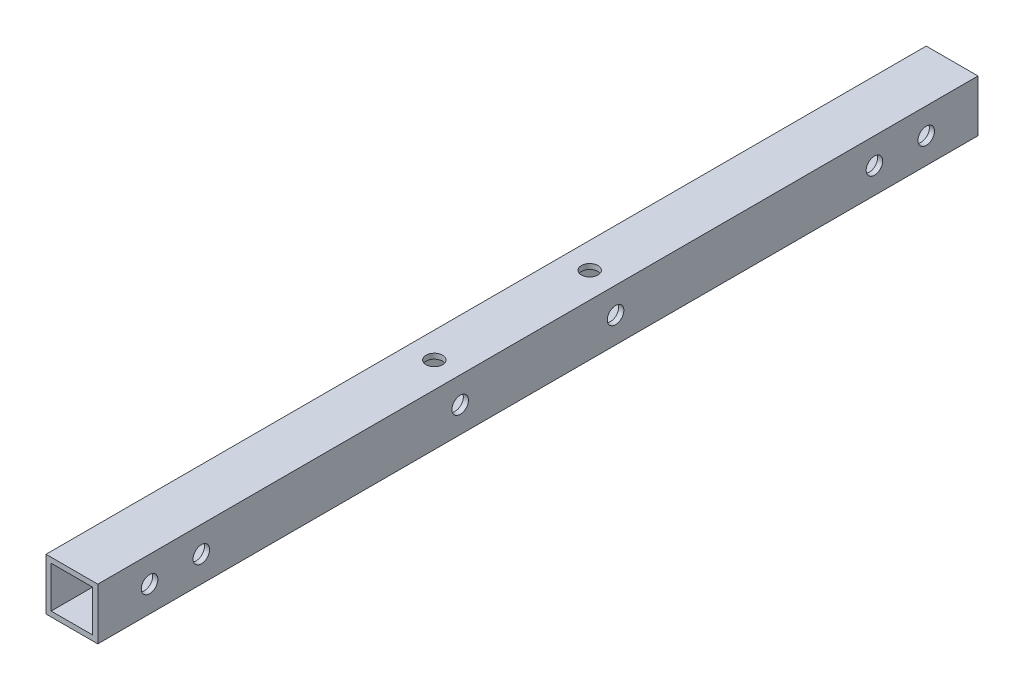
ISO-10303-21;
HEADER;
FILE_DESCRIPTION(('STEP AP214'),'2;1');
FILE_NAME('part.step','',(''),(''),'','','');
FILE_SCHEMA(('AUTOMOTIVE_DESIGN { 1 0 10303 214 1 1 1 1 }'));
ENDSEC;
DATA;
#1=APPLICATION_CONTEXT('core data for automotive mechanical design processes');
#2=APPLICATION_PROTOCOL_DEFINITION('international standard','automotive_design',2000,#1);
#3=PRODUCT_CONTEXT('',#1,'mechanical');
#4=PRODUCT('Part','Part','',(#3));
#5=PRODUCT_RELATED_PRODUCT_CATEGORY('part','',(#4));
#6=PRODUCT_DEFINITION_FORMATION('','',#4);
#7=PRODUCT_DEFINITION_CONTEXT('part definition',#1,'design');
#8=PRODUCT_DEFINITION('design','',#6,#7);
#9=PRODUCT_DEFINITION_SHAPE('','',#8);
#10=(LENGTH_UNIT() NAMED_UNIT(*) SI_UNIT(.MILLI.,.METRE.));
#11=(NAMED_UNIT(*) PLANE_ANGLE_UNIT() SI_UNIT($,.RADIAN.));
#12=(NAMED_UNIT(*) SI_UNIT($,.STERADIAN.) SOLID_ANGLE_UNIT());
#13=UNCERTAINTY_MEASURE_WITH_UNIT(LENGTH_MEASURE(1.E-05),#10,'distance_accuracy_value','');
#14=(GEOMETRIC_REPRESENTATION_CONTEXT(3) GLOBAL_UNCERTAINTY_ASSIGNED_CONTEXT((#13)) GLOBAL_UNIT_ASSIGNED_CONTEXT((#10,
#11,#12)) REPRESENTATION_CONTEXT('',''));
#15=CARTESIAN_POINT('',(0.,0.,0.));
#16=DIRECTION('',(0.,0.,1.));
#17=DIRECTION('',(1.,0.,0.));
#18=AXIS2_PLACEMENT_3D('',#15,#16,#17);
#19=CARTESIAN_POINT('',(0.,0.,170.));
#20=DIRECTION('',(0.,0.,1.));
#21=DIRECTION('',(1.,0.,0.));
#22=AXIS2_PLACEMENT_3D('',#19,#20,#21);
#23=PLANE('',#22);
#24=DIRECTION('',(0.,1.,0.));
#25=VECTOR('',#24,1.);
#26=CARTESIAN_POINT('',(5.,5.,170.));
#27=LINE('',#26,#25);
#28=CARTESIAN_POINT('',(5.,-5.,170.));
#29=VERTEX_POINT('',#28);
#30=CARTESIAN_POINT('',(5.,5.,170.));
#31=VERTEX_POINT('',#30);
#32=EDGE_CURVE('E138',#29,#31,#27,.T.);
#33=ORIENTED_EDGE('',*,*,#32,.T.);
#34=DIRECTION('',(-1.,0.,0.));
#35=VECTOR('',#34,1.);
#36=CARTESIAN_POINT('',(-5.,5.,170.));
#37=LINE('',#36,#35);
#38=CARTESIAN_POINT('',(-5.,5.,170.));
#39=VERTEX_POINT('',#38);
#40=EDGE_CURVE('E141',#31,#39,#37,.T.);
#41=ORIENTED_EDGE('',*,*,#40,.T.);
#42=DIRECTION('',(0.,-1.,0.));
#43=VECTOR('',#42,1.);
#44=CARTESIAN_POINT('',(-5.,5.,170.));
#45=LINE('',#44,#43);
#46=CARTESIAN_POINT('',(-5.,-5.,170.));
#47=VERTEX_POINT('',#46);
#48=EDGE_CURVE('E144',#39,#47,#45,.T.);
#49=ORIENTED_EDGE('',*,*,#48,.T.);
#50=DIRECTION('',(1.,0.,0.));
#51=VECTOR('',#50,1.);
#52=CARTESIAN_POINT('',(-5.,-5.,170.));
#53=LINE('',#52,#51);
#54=EDGE_CURVE('E146',#47,#29,#53,.T.);
#55=ORIENTED_EDGE('',*,*,#54,.T.);
#56=EDGE_LOOP('',(#33,#41,#49,#55));
#57=FACE_BOUND('',#56,.T.);
#58=DIRECTION('',(-1.,0.,0.));
#59=VECTOR('',#58,1.);
#60=CARTESIAN_POINT('',(-4.,4.,170.));
#61=LINE('',#60,#59);
#62=CARTESIAN_POINT('',(4.,4.,170.));
#63=VERTEX_POINT('',#62);
#64=CARTESIAN_POINT('',(-4.,4.,170.));
#65=VERTEX_POINT('',#64);
#66=EDGE_CURVE('E108',#63,#65,#61,.T.);
#67=ORIENTED_EDGE('',*,*,#66,.F.);
#68=DIRECTION('',(0.,1.,0.));
#69=VECTOR('',#68,1.);
#70=CARTESIAN_POINT('',(4.,4.,170.));
#71=LINE('',#70,#69);
#72=CARTESIAN_POINT('',(4.,-4.,170.));
#73=VERTEX_POINT('',#72);
#74=EDGE_CURVE('E100',#73,#63,#71,.T.);
#75=ORIENTED_EDGE('',*,*,#74,.F.);
#76=DIRECTION('',(1.,0.,0.));
#77=VECTOR('',#76,1.);
#78=CARTESIAN_POINT('',(-4.,-4.,170.));
#79=LINE('',#78,#77);
#80=CARTESIAN_POINT('',(-4.,-4.,170.));
#81=VERTEX_POINT('',#80);
#82=EDGE_CURVE('E122',#81,#73,#79,.T.);
#83=ORIENTED_EDGE('',*,*,#82,.F.);
#84=DIRECTION('',(0.,-1.,0.));
#85=VECTOR('',#84,1.);
#86=CARTESIAN_POINT('',(-4.,4.,170.));
#87=LINE('',#86,#85);
#88=EDGE_CURVE('E120',#65,#81,#87,.T.);
#89=ORIENTED_EDGE('',*,*,#88,.F.);
#90=EDGE_LOOP('',(#67,#75,#83,#89));
#91=FACE_BOUND('',#90,.T.);
#92=ADVANCED_FACE('F33',(#57,#91),#23,.T.);
#93=CARTESIAN_POINT('',(0.,0.,0.));
#94=DIRECTION('',(0.,0.,1.));
#95=DIRECTION('',(1.,0.,0.));
#96=AXIS2_PLACEMENT_3D('',#93,#94,#95);
#97=PLANE('',#96);
#98=DIRECTION('',(0.,1.,0.));
#99=VECTOR('',#98,1.);
#100=CARTESIAN_POINT('',(5.,5.,0.));
#101=LINE('',#100,#99);
#102=CARTESIAN_POINT('',(5.,-5.,0.));
#103=VERTEX_POINT('',#102);
#104=CARTESIAN_POINT('',(5.,5.,0.));
#105=VERTEX_POINT('',#104);
#106=EDGE_CURVE('E116',#103,#105,#101,.T.);
#107=ORIENTED_EDGE('',*,*,#106,.F.);
#108=DIRECTION('',(1.,0.,0.));
#109=VECTOR('',#108,1.);
#110=CARTESIAN_POINT('',(-5.,-5.,0.));
#111=LINE('',#110,#109);
#112=CARTESIAN_POINT('',(-5.,-5.,0.));
#113=VERTEX_POINT('',#112);
#114=EDGE_CURVE('E142',#113,#103,#111,.T.);
#115=ORIENTED_EDGE('',*,*,#114,.F.);
#116=DIRECTION('',(0.,-1.,0.));
#117=VECTOR('',#116,1.);
#118=CARTESIAN_POINT('',(-5.,5.,0.));
#119=LINE('',#118,#117);
#120=CARTESIAN_POINT('',(-5.,5.,0.));
#121=VERTEX_POINT('',#120);
#122=EDGE_CURVE('E153',#121,#113,#119,.T.);
#123=ORIENTED_EDGE('',*,*,#122,.F.);
#124=DIRECTION('',(-1.,0.,0.));
#125=VECTOR('',#124,1.);
#126=CARTESIAN_POINT('',(-5.,5.,0.));
#127=LINE('',#126,#125);
#128=EDGE_CURVE('E151',#105,#121,#127,.T.);
#129=ORIENTED_EDGE('',*,*,#128,.F.);
#130=EDGE_LOOP('',(#107,#115,#123,#129));
#131=FACE_BOUND('',#130,.T.);
#132=DIRECTION('',(0.,1.,0.));
#133=VECTOR('',#132,1.);
#134=CARTESIAN_POINT('',(4.,4.,0.));
#135=LINE('',#134,#133);
#136=CARTESIAN_POINT('',(4.,-4.,0.));
#137=VERTEX_POINT('',#136);
#138=CARTESIAN_POINT('',(4.,4.,0.));
#139=VERTEX_POINT('',#138);
#140=EDGE_CURVE('E58',#137,#139,#135,.T.);
#141=ORIENTED_EDGE('',*,*,#140,.T.);
#142=DIRECTION('',(-1.,0.,0.));
#143=VECTOR('',#142,1.);
#144=CARTESIAN_POINT('',(-4.,4.,0.));
#145=LINE('',#144,#143);
#146=CARTESIAN_POINT('',(-4.,4.,0.));
#147=VERTEX_POINT('',#146);
#148=EDGE_CURVE('E115',#139,#147,#145,.T.);
#149=ORIENTED_EDGE('',*,*,#148,.T.);
#150=DIRECTION('',(0.,-1.,0.));
#151=VECTOR('',#150,1.);
#152=CARTESIAN_POINT('',(-4.,4.,0.));
#153=LINE('',#152,#151);
#154=CARTESIAN_POINT('',(-4.,-4.,0.));
#155=VERTEX_POINT('',#154);
#156=EDGE_CURVE('E130',#147,#155,#153,.T.);
#157=ORIENTED_EDGE('',*,*,#156,.T.);
#158=DIRECTION('',(1.,0.,0.));
#159=VECTOR('',#158,1.);
#160=CARTESIAN_POINT('',(-4.,-4.,0.));
#161=LINE('',#160,#159);
#162=EDGE_CURVE('E109',#155,#137,#161,.T.);
#163=ORIENTED_EDGE('',*,*,#162,.T.);
#164=EDGE_LOOP('',(#141,#149,#157,#163));
#165=FACE_BOUND('',#164,.T.);
#166=ADVANCED_FACE('F287',(#131,#165),#97,.F.);
#167=CARTESIAN_POINT('',(5.,5.,170.));
#168=DIRECTION('',(-1.,0.,0.));
#169=DIRECTION('',(0.,-1.,0.));
#170=AXIS2_PLACEMENT_3D('',#167,#168,#169);
#171=PLANE('',#170);
#172=CARTESIAN_POINT('',(5.,0.,70.));
#173=DIRECTION('',(1.,0.,0.));
#174=DIRECTION('',(0.,1.,0.));
#175=AXIS2_PLACEMENT_3D('',#172,#173,#174);
#176=CIRCLE('',#175,1.60000000000001);
#177=CARTESIAN_POINT('',(5.,1.60000000000001,70.));
#178=VERTEX_POINT('',#177);
#179=EDGE_CURVE('E217',#178,#178,#176,.T.);
#180=ORIENTED_EDGE('',*,*,#179,.F.);
#181=EDGE_LOOP('',(#180));
#182=FACE_BOUND('',#181,.T.);
#183=CARTESIAN_POINT('',(5.,0.,150.));
#184=DIRECTION('',(1.,0.,0.));
#185=DIRECTION('',(0.,-1.,0.));
#186=AXIS2_PLACEMENT_3D('',#183,#184,#185);
#187=CIRCLE('',#186,1.60000000000002);
#188=CARTESIAN_POINT('',(5.,-1.60000000000002,150.));
#189=VERTEX_POINT('',#188);
#190=EDGE_CURVE('E218',#189,#189,#187,.T.);
#191=ORIENTED_EDGE('',*,*,#190,.F.);
#192=EDGE_LOOP('',(#191));
#193=FACE_BOUND('',#192,.T.);
#194=CARTESIAN_POINT('',(5.,0.,160.));
#195=DIRECTION('',(1.,0.,0.));
#196=DIRECTION('',(0.,-1.,0.));
#197=AXIS2_PLACEMENT_3D('',#194,#195,#196);
#198=CIRCLE('',#197,1.60000000000002);
#199=CARTESIAN_POINT('',(5.,-1.60000000000002,160.));
#200=VERTEX_POINT('',#199);
#201=EDGE_CURVE('E225',#200,#200,#198,.T.);
#202=ORIENTED_EDGE('',*,*,#201,.F.);
#203=EDGE_LOOP('',(#202));
#204=FACE_BOUND('',#203,.T.);
#205=CARTESIAN_POINT('',(5.,0.,10.));
#206=DIRECTION('',(1.,0.,0.));
#207=DIRECTION('',(0.,1.,0.));
#208=AXIS2_PLACEMENT_3D('',#205,#206,#207);
#209=CIRCLE('',#208,1.6);
#210=CARTESIAN_POINT('',(5.,1.6,10.));
#211=VERTEX_POINT('',#210);
#212=EDGE_CURVE('E230',#211,#211,#209,.T.);
#213=ORIENTED_EDGE('',*,*,#212,.F.);
#214=EDGE_LOOP('',(#213));
#215=FACE_BOUND('',#214,.T.);
#216=CARTESIAN_POINT('',(5.,0.,100.));
#217=DIRECTION('',(1.,0.,0.));
#218=DIRECTION('',(0.,-1.,0.));
#219=AXIS2_PLACEMENT_3D('',#216,#217,#218);
#220=CIRCLE('',#219,1.60000000000001);
#221=CARTESIAN_POINT('',(5.,-1.6,100.));
#222=VERTEX_POINT('',#221);
#223=EDGE_CURVE('E211',#222,#222,#220,.T.);
#224=ORIENTED_EDGE('',*,*,#223,.F.);
#225=EDGE_LOOP('',(#224));
#226=FACE_BOUND('',#225,.T.);
#227=CARTESIAN_POINT('',(5.,0.,20.));
#228=DIRECTION('',(1.,0.,0.));
#229=DIRECTION('',(0.,1.,0.));
#230=AXIS2_PLACEMENT_3D('',#227,#228,#229);
#231=CIRCLE('',#230,1.6);
#232=CARTESIAN_POINT('',(5.,1.6,20.));
#233=VERTEX_POINT('',#232);
#234=EDGE_CURVE('E237',#233,#233,#231,.T.);
#235=ORIENTED_EDGE('',*,*,#234,.F.);
#236=EDGE_LOOP('',(#235));
#237=FACE_BOUND('',#236,.T.);
#238=ORIENTED_EDGE('',*,*,#106,.T.);
#239=DIRECTION('',(0.,0.,-1.));
#240=VECTOR('',#239,1.);
#241=CARTESIAN_POINT('',(5.,5.,170.));
#242=LINE('',#241,#240);
#243=EDGE_CURVE('E11',#31,#105,#242,.T.);
#244=ORIENTED_EDGE('',*,*,#243,.F.);
#245=ORIENTED_EDGE('',*,*,#32,.F.);
#246=DIRECTION('',(0.,0.,-1.));
#247=VECTOR('',#246,1.);
#248=CARTESIAN_POINT('',(5.,-5.,170.));
#249=LINE('',#248,#247);
#250=EDGE_CURVE('E148',#29,#103,#249,.T.);
#251=ORIENTED_EDGE('',*,*,#250,.T.);
#252=EDGE_LOOP('',(#238,#244,#245,#251));
#253=FACE_BOUND('',#252,.T.);
#254=ADVANCED_FACE('F35',(#182,#193,#204,#215,#226,#237,#253),#171,.F.);
#255=CARTESIAN_POINT('',(-5.,5.,170.));
#256=DIRECTION('',(0.,-1.,0.));
#257=DIRECTION('',(0.,0.,-1.));
#258=AXIS2_PLACEMENT_3D('',#255,#256,#257);
#259=PLANE('',#258);
#260=CARTESIAN_POINT('',(0.,5.,70.));
#261=DIRECTION('',(0.,1.,0.));
#262=DIRECTION('',(0.,0.,1.));
#263=AXIS2_PLACEMENT_3D('',#260,#261,#262);
#264=CIRCLE('',#263,1.6);
#265=CARTESIAN_POINT('',(0.,5.,71.6));
#266=VERTEX_POINT('',#265);
#267=EDGE_CURVE('E195',#266,#266,#264,.T.);
#268=ORIENTED_EDGE('',*,*,#267,.F.);
#269=EDGE_LOOP('',(#268));
#270=FACE_BOUND('',#269,.T.);
#271=CARTESIAN_POINT('',(0.,5.,100.));
#272=DIRECTION('',(0.,1.,0.));
#273=DIRECTION('',(0.,0.,-1.));
#274=AXIS2_PLACEMENT_3D('',#271,#272,#273);
#275=CIRCLE('',#274,1.6);
#276=CARTESIAN_POINT('',(0.,5.,98.4));
#277=VERTEX_POINT('',#276);
#278=EDGE_CURVE('E205',#277,#277,#275,.T.);
#279=ORIENTED_EDGE('',*,*,#278,.F.);
#280=EDGE_LOOP('',(#279));
#281=FACE_BOUND('',#280,.T.);
#282=ORIENTED_EDGE('',*,*,#128,.T.);
#283=DIRECTION('',(0.,0.,-1.));
#284=VECTOR('',#283,1.);
#285=CARTESIAN_POINT('',(-5.,5.,170.));
#286=LINE('',#285,#284);
#287=EDGE_CURVE('E42',#39,#121,#286,.T.);
#288=ORIENTED_EDGE('',*,*,#287,.F.);
#289=ORIENTED_EDGE('',*,*,#40,.F.);
#290=ORIENTED_EDGE('',*,*,#243,.T.);
#291=EDGE_LOOP('',(#282,#288,#289,#290));
#292=FACE_BOUND('',#291,.T.);
#293=ADVANCED_FACE('F286',(#270,#281,#292),#259,.F.);
#294=CARTESIAN_POINT('',(-5.,5.,170.));
#295=DIRECTION('',(1.,0.,0.));
#296=DIRECTION('',(0.,1.,0.));
#297=AXIS2_PLACEMENT_3D('',#294,#295,#296);
#298=PLANE('',#297);
#299=CARTESIAN_POINT('',(-5.,0.,70.));
#300=DIRECTION('',(1.,0.,0.));
#301=DIRECTION('',(0.,1.,0.));
#302=AXIS2_PLACEMENT_3D('',#299,#300,#301);
#303=CIRCLE('',#302,1.60000000000001);
#304=CARTESIAN_POINT('',(-5.,1.6,70.));
#305=VERTEX_POINT('',#304);
#306=EDGE_CURVE('E222',#305,#305,#303,.F.);
#307=ORIENTED_EDGE('',*,*,#306,.F.);
#308=EDGE_LOOP('',(#307));
#309=FACE_BOUND('',#308,.T.);
#310=CARTESIAN_POINT('',(-5.,0.,150.));
#311=DIRECTION('',(1.,0.,0.));
#312=DIRECTION('',(0.,1.,0.));
#313=AXIS2_PLACEMENT_3D('',#310,#311,#312);
#314=CIRCLE('',#313,1.60000000000002);
#315=CARTESIAN_POINT('',(-5.,1.60000000000002,150.));
#316=VERTEX_POINT('',#315);
#317=EDGE_CURVE('E221',#316,#316,#314,.F.);
#318=ORIENTED_EDGE('',*,*,#317,.F.);
#319=EDGE_LOOP('',(#318));
#320=FACE_BOUND('',#319,.T.);
#321=CARTESIAN_POINT('',(-5.,0.,160.));
#322=DIRECTION('',(1.,0.,0.));
#323=DIRECTION('',(0.,1.,0.));
#324=AXIS2_PLACEMENT_3D('',#321,#322,#323);
#325=CIRCLE('',#324,1.60000000000002);
#326=CARTESIAN_POINT('',(-5.,1.60000000000002,160.));
#327=VERTEX_POINT('',#326);
#328=EDGE_CURVE('E234',#327,#327,#325,.F.);
#329=ORIENTED_EDGE('',*,*,#328,.F.);
#330=EDGE_LOOP('',(#329));
#331=FACE_BOUND('',#330,.T.);
#332=CARTESIAN_POINT('',(-5.,0.,10.));
#333=DIRECTION('',(1.,0.,0.));
#334=DIRECTION('',(0.,1.,0.));
#335=AXIS2_PLACEMENT_3D('',#332,#333,#334);
#336=CIRCLE('',#335,1.6);
#337=CARTESIAN_POINT('',(-5.,1.6,10.));
#338=VERTEX_POINT('',#337);
#339=EDGE_CURVE('E233',#338,#338,#336,.F.);
#340=ORIENTED_EDGE('',*,*,#339,.F.);
#341=EDGE_LOOP('',(#340));
#342=FACE_BOUND('',#341,.T.);
#343=CARTESIAN_POINT('',(-5.,0.,100.));
#344=DIRECTION('',(1.,0.,0.));
#345=DIRECTION('',(0.,1.,0.));
#346=AXIS2_PLACEMENT_3D('',#343,#344,#345);
#347=CIRCLE('',#346,1.60000000000001);
#348=CARTESIAN_POINT('',(-5.,1.6,100.));
#349=VERTEX_POINT('',#348);
#350=EDGE_CURVE('E214',#349,#349,#347,.F.);
#351=ORIENTED_EDGE('',*,*,#350,.F.);
#352=EDGE_LOOP('',(#351));
#353=FACE_BOUND('',#352,.T.);
#354=CARTESIAN_POINT('',(-5.,0.,20.));
#355=DIRECTION('',(1.,0.,0.));
#356=DIRECTION('',(0.,1.,0.));
#357=AXIS2_PLACEMENT_3D('',#354,#355,#356);
#358=CIRCLE('',#357,1.6);
#359=CARTESIAN_POINT('',(-5.,1.6,20.));
#360=VERTEX_POINT('',#359);
#361=EDGE_CURVE('E167',#360,#360,#358,.F.);
#362=ORIENTED_EDGE('',*,*,#361,.F.);
#363=EDGE_LOOP('',(#362));
#364=FACE_BOUND('',#363,.T.);
#365=ORIENTED_EDGE('',*,*,#122,.T.);
#366=DIRECTION('',(0.,0.,-1.));
#367=VECTOR('',#366,1.);
#368=CARTESIAN_POINT('',(-5.,-5.,170.));
#369=LINE('',#368,#367);
#370=EDGE_CURVE('E158',#47,#113,#369,.T.);
#371=ORIENTED_EDGE('',*,*,#370,.F.);
#372=ORIENTED_EDGE('',*,*,#48,.F.);
#373=ORIENTED_EDGE('',*,*,#287,.T.);
#374=EDGE_LOOP('',(#365,#371,#372,#373));
#375=FACE_BOUND('',#374,.T.);
#376=ADVANCED_FACE('F305',(#309,#320,#331,#342,#353,#364,#375),#298,.F.);
#377=CARTESIAN_POINT('',(-5.,-5.,170.));
#378=DIRECTION('',(0.,1.,0.));
#379=DIRECTION('',(0.,0.,1.));
#380=AXIS2_PLACEMENT_3D('',#377,#378,#379);
#381=PLANE('',#380);
#382=CARTESIAN_POINT('',(0.,-5.,70.));
#383=DIRECTION('',(0.,1.,0.));
#384=DIRECTION('',(0.,0.,1.));
#385=AXIS2_PLACEMENT_3D('',#382,#383,#384);
#386=CIRCLE('',#385,1.6);
#387=CARTESIAN_POINT('',(0.,-5.,71.6));
#388=VERTEX_POINT('',#387);
#389=EDGE_CURVE('E189',#388,#388,#386,.T.);
#390=ORIENTED_EDGE('',*,*,#389,.T.);
#391=EDGE_LOOP('',(#390));
#392=FACE_BOUND('',#391,.T.);
#393=CARTESIAN_POINT('',(0.,-5.,100.));
#394=DIRECTION('',(0.,1.,0.));
#395=DIRECTION('',(0.,0.,-1.));
#396=AXIS2_PLACEMENT_3D('',#393,#394,#395);
#397=CIRCLE('',#396,1.6);
#398=CARTESIAN_POINT('',(0.,-5.,98.4));
#399=VERTEX_POINT('',#398);
#400=EDGE_CURVE('E200',#399,#399,#397,.T.);
#401=ORIENTED_EDGE('',*,*,#400,.T.);
#402=EDGE_LOOP('',(#401));
#403=FACE_BOUND('',#402,.T.);
#404=ORIENTED_EDGE('',*,*,#114,.T.);
#405=ORIENTED_EDGE('',*,*,#250,.F.);
#406=ORIENTED_EDGE('',*,*,#54,.F.);
#407=ORIENTED_EDGE('',*,*,#370,.T.);
#408=EDGE_LOOP('',(#404,#405,#406,#407));
#409=FACE_BOUND('',#408,.T.);
#410=ADVANCED_FACE('F263',(#392,#403,#409),#381,.F.);
#411=CARTESIAN_POINT('',(4.,4.,170.));
#412=DIRECTION('',(-1.,0.,0.));
#413=DIRECTION('',(0.,-1.,0.));
#414=AXIS2_PLACEMENT_3D('',#411,#412,#413);
#415=PLANE('',#414);
#416=CARTESIAN_POINT('',(4.,0.,70.));
#417=DIRECTION('',(-1.,0.,0.));
#418=DIRECTION('',(0.,-1.,0.));
#419=AXIS2_PLACEMENT_3D('',#416,#417,#418);
#420=CIRCLE('',#419,1.60000000000001);
#421=CARTESIAN_POINT('',(4.,-1.6,70.));
#422=VERTEX_POINT('',#421);
#423=EDGE_CURVE('E128',#422,#422,#420,.T.);
#424=ORIENTED_EDGE('',*,*,#423,.F.);
#425=EDGE_LOOP('',(#424));
#426=FACE_BOUND('',#425,.T.);
#427=CARTESIAN_POINT('',(4.,0.,150.));
#428=DIRECTION('',(-1.,0.,0.));
#429=DIRECTION('',(0.,-1.,0.));
#430=AXIS2_PLACEMENT_3D('',#427,#428,#429);
#431=CIRCLE('',#430,1.60000000000002);
#432=CARTESIAN_POINT('',(4.,-1.60000000000002,150.));
#433=VERTEX_POINT('',#432);
#434=EDGE_CURVE('E183',#433,#433,#431,.T.);
#435=ORIENTED_EDGE('',*,*,#434,.F.);
#436=EDGE_LOOP('',(#435));
#437=FACE_BOUND('',#436,.T.);
#438=CARTESIAN_POINT('',(4.,0.,160.));
#439=DIRECTION('',(-1.,0.,0.));
#440=DIRECTION('',(0.,-1.,0.));
#441=AXIS2_PLACEMENT_3D('',#438,#439,#440);
#442=CIRCLE('',#441,1.60000000000002);
#443=CARTESIAN_POINT('',(4.,-1.60000000000002,160.));
#444=VERTEX_POINT('',#443);
#445=EDGE_CURVE('E179',#444,#444,#442,.T.);
#446=ORIENTED_EDGE('',*,*,#445,.F.);
#447=EDGE_LOOP('',(#446));
#448=FACE_BOUND('',#447,.T.);
#449=CARTESIAN_POINT('',(4.,0.,10.));
#450=DIRECTION('',(-1.,0.,0.));
#451=DIRECTION('',(0.,-1.,0.));
#452=AXIS2_PLACEMENT_3D('',#449,#450,#451);
#453=CIRCLE('',#452,1.6);
#454=CARTESIAN_POINT('',(4.,-1.6,10.));
#455=VERTEX_POINT('',#454);
#456=EDGE_CURVE('E175',#455,#455,#453,.T.);
#457=ORIENTED_EDGE('',*,*,#456,.F.);
#458=EDGE_LOOP('',(#457));
#459=FACE_BOUND('',#458,.T.);
#460=CARTESIAN_POINT('',(4.,0.,100.));
#461=DIRECTION('',(-1.,0.,0.));
#462=DIRECTION('',(0.,-1.,0.));
#463=AXIS2_PLACEMENT_3D('',#460,#461,#462);
#464=CIRCLE('',#463,1.60000000000001);
#465=CARTESIAN_POINT('',(4.,-1.6,100.));
#466=VERTEX_POINT('',#465);
#467=EDGE_CURVE('E171',#466,#466,#464,.T.);
#468=ORIENTED_EDGE('',*,*,#467,.F.);
#469=EDGE_LOOP('',(#468));
#470=FACE_BOUND('',#469,.T.);
#471=CARTESIAN_POINT('',(4.,0.,20.));
#472=DIRECTION('',(-1.,0.,0.));
#473=DIRECTION('',(0.,-1.,0.));
#474=AXIS2_PLACEMENT_3D('',#471,#472,#473);
#475=CIRCLE('',#474,1.6);
#476=CARTESIAN_POINT('',(4.,-1.6,20.));
#477=VERTEX_POINT('',#476);
#478=EDGE_CURVE('E166',#477,#477,#475,.T.);
#479=ORIENTED_EDGE('',*,*,#478,.F.);
#480=EDGE_LOOP('',(#479));
#481=FACE_BOUND('',#480,.T.);
#482=ORIENTED_EDGE('',*,*,#140,.F.);
#483=DIRECTION('',(0.,0.,-1.));
#484=VECTOR('',#483,1.);
#485=CARTESIAN_POINT('',(4.,-4.,170.));
#486=LINE('',#485,#484);
#487=EDGE_CURVE('E104',#73,#137,#486,.T.);
#488=ORIENTED_EDGE('',*,*,#487,.F.);
#489=ORIENTED_EDGE('',*,*,#74,.T.);
#490=DIRECTION('',(0.,0.,-1.));
#491=VECTOR('',#490,1.);
#492=CARTESIAN_POINT('',(4.,4.,170.));
#493=LINE('',#492,#491);
#494=EDGE_CURVE('E103',#63,#139,#493,.T.);
#495=ORIENTED_EDGE('',*,*,#494,.T.);
#496=EDGE_LOOP('',(#482,#488,#489,#495));
#497=FACE_BOUND('',#496,.T.);
#498=ADVANCED_FACE('F102',(#426,#437,#448,#459,#470,#481,#497),#415,.T.);
#499=CARTESIAN_POINT('',(-4.,4.,170.));
#500=DIRECTION('',(0.,-1.,0.));
#501=DIRECTION('',(0.,0.,-1.));
#502=AXIS2_PLACEMENT_3D('',#499,#500,#501);
#503=PLANE('',#502);
#504=CARTESIAN_POINT('',(0.,4.,70.));
#505=DIRECTION('',(0.,-1.,0.));
#506=DIRECTION('',(0.,0.,-1.));
#507=AXIS2_PLACEMENT_3D('',#504,#505,#506);
#508=CIRCLE('',#507,1.6);
#509=CARTESIAN_POINT('',(0.,4.,68.4));
#510=VERTEX_POINT('',#509);
#511=EDGE_CURVE('E208',#510,#510,#508,.T.);
#512=ORIENTED_EDGE('',*,*,#511,.F.);
#513=EDGE_LOOP('',(#512));
#514=FACE_BOUND('',#513,.T.);
#515=CARTESIAN_POINT('',(0.,4.,100.));
#516=DIRECTION('',(0.,-1.,0.));
#517=DIRECTION('',(0.,0.,-1.));
#518=AXIS2_PLACEMENT_3D('',#515,#516,#517);
#519=CIRCLE('',#518,1.6);
#520=CARTESIAN_POINT('',(0.,4.,98.4));
#521=VERTEX_POINT('',#520);
#522=EDGE_CURVE('E188',#521,#521,#519,.T.);
#523=ORIENTED_EDGE('',*,*,#522,.F.);
#524=EDGE_LOOP('',(#523));
#525=FACE_BOUND('',#524,.T.);
#526=ORIENTED_EDGE('',*,*,#148,.F.);
#527=ORIENTED_EDGE('',*,*,#494,.F.);
#528=ORIENTED_EDGE('',*,*,#66,.T.);
#529=DIRECTION('',(0.,0.,-1.));
#530=VECTOR('',#529,1.);
#531=CARTESIAN_POINT('',(-4.,4.,170.));
#532=LINE('',#531,#530);
#533=EDGE_CURVE('E117',#65,#147,#532,.T.);
#534=ORIENTED_EDGE('',*,*,#533,.T.);
#535=EDGE_LOOP('',(#526,#527,#528,#534));
#536=FACE_BOUND('',#535,.T.);
#537=ADVANCED_FACE('F112',(#514,#525,#536),#503,.T.);
#538=CARTESIAN_POINT('',(-4.,4.,170.));
#539=DIRECTION('',(1.,0.,0.));
#540=DIRECTION('',(0.,0.,-1.));
#541=AXIS2_PLACEMENT_3D('',#538,#539,#540);
#542=PLANE('',#541);
#543=CARTESIAN_POINT('',(-4.,0.,70.));
#544=DIRECTION('',(1.,0.,0.));
#545=DIRECTION('',(0.,0.,-1.));
#546=AXIS2_PLACEMENT_3D('',#543,#544,#545);
#547=CIRCLE('',#546,1.60000000000001);
#548=CARTESIAN_POINT('',(-4.,0.,68.4));
#549=VERTEX_POINT('',#548);
#550=EDGE_CURVE('E184',#549,#549,#547,.T.);
#551=ORIENTED_EDGE('',*,*,#550,.F.);
#552=EDGE_LOOP('',(#551));
#553=FACE_BOUND('',#552,.T.);
#554=CARTESIAN_POINT('',(-4.,0.,150.));
#555=DIRECTION('',(1.,0.,0.));
#556=DIRECTION('',(0.,0.,-1.));
#557=AXIS2_PLACEMENT_3D('',#554,#555,#556);
#558=CIRCLE('',#557,1.60000000000002);
#559=CARTESIAN_POINT('',(-4.,0.,148.4));
#560=VERTEX_POINT('',#559);
#561=EDGE_CURVE('E180',#560,#560,#558,.T.);
#562=ORIENTED_EDGE('',*,*,#561,.F.);
#563=EDGE_LOOP('',(#562));
#564=FACE_BOUND('',#563,.T.);
#565=CARTESIAN_POINT('',(-4.,0.,160.));
#566=DIRECTION('',(1.,0.,0.));
#567=DIRECTION('',(0.,0.,-1.));
#568=AXIS2_PLACEMENT_3D('',#565,#566,#567);
#569=CIRCLE('',#568,1.60000000000002);
#570=CARTESIAN_POINT('',(-4.,0.,158.4));
#571=VERTEX_POINT('',#570);
#572=EDGE_CURVE('E176',#571,#571,#569,.T.);
#573=ORIENTED_EDGE('',*,*,#572,.F.);
#574=EDGE_LOOP('',(#573));
#575=FACE_BOUND('',#574,.T.);
#576=CARTESIAN_POINT('',(-4.,0.,10.));
#577=DIRECTION('',(1.,0.,0.));
#578=DIRECTION('',(0.,0.,-1.));
#579=AXIS2_PLACEMENT_3D('',#576,#577,#578);
#580=CIRCLE('',#579,1.6);
#581=CARTESIAN_POINT('',(-4.,0.,8.40000000000001));
#582=VERTEX_POINT('',#581);
#583=EDGE_CURVE('E172',#582,#582,#580,.T.);
#584=ORIENTED_EDGE('',*,*,#583,.F.);
#585=EDGE_LOOP('',(#584));
#586=FACE_BOUND('',#585,.T.);
#587=CARTESIAN_POINT('',(-4.,0.,100.));
#588=DIRECTION('',(1.,0.,0.));
#589=DIRECTION('',(0.,0.,-1.));
#590=AXIS2_PLACEMENT_3D('',#587,#588,#589);
#591=CIRCLE('',#590,1.60000000000001);
#592=CARTESIAN_POINT('',(-4.,0.,98.4));
#593=VERTEX_POINT('',#592);
#594=EDGE_CURVE('E168',#593,#593,#591,.T.);
#595=ORIENTED_EDGE('',*,*,#594,.F.);
#596=EDGE_LOOP('',(#595));
#597=FACE_BOUND('',#596,.T.);
#598=CARTESIAN_POINT('',(-4.,0.,20.));
#599=DIRECTION('',(1.,0.,0.));
#600=DIRECTION('',(0.,0.,-1.));
#601=AXIS2_PLACEMENT_3D('',#598,#599,#600);
#602=CIRCLE('',#601,1.6);
#603=CARTESIAN_POINT('',(-4.,0.,18.4));
#604=VERTEX_POINT('',#603);
#605=EDGE_CURVE('E163',#604,#604,#602,.T.);
#606=ORIENTED_EDGE('',*,*,#605,.F.);
#607=EDGE_LOOP('',(#606));
#608=FACE_BOUND('',#607,.T.);
#609=ORIENTED_EDGE('',*,*,#156,.F.);
#610=ORIENTED_EDGE('',*,*,#533,.F.);
#611=ORIENTED_EDGE('',*,*,#88,.T.);
#612=DIRECTION('',(0.,0.,-1.));
#613=VECTOR('',#612,1.);
#614=CARTESIAN_POINT('',(-4.,-4.,170.));
#615=LINE('',#614,#613);
#616=EDGE_CURVE('E50',#81,#155,#615,.T.);
#617=ORIENTED_EDGE('',*,*,#616,.T.);
#618=EDGE_LOOP('',(#609,#610,#611,#617));
#619=FACE_BOUND('',#618,.T.);
#620=ADVANCED_FACE('F326',(#553,#564,#575,#586,#597,#608,#619),#542,.T.);
#621=CARTESIAN_POINT('',(-4.,-4.,170.));
#622=DIRECTION('',(0.,1.,0.));
#623=DIRECTION('',(0.,0.,1.));
#624=AXIS2_PLACEMENT_3D('',#621,#622,#623);
#625=PLANE('',#624);
#626=CARTESIAN_POINT('',(0.,-4.,70.));
#627=DIRECTION('',(0.,1.,0.));
#628=DIRECTION('',(0.,0.,1.));
#629=AXIS2_PLACEMENT_3D('',#626,#627,#628);
#630=CIRCLE('',#629,1.6);
#631=CARTESIAN_POINT('',(0.,-4.,71.6));
#632=VERTEX_POINT('',#631);
#633=EDGE_CURVE('E37',#632,#632,#630,.T.);
#634=ORIENTED_EDGE('',*,*,#633,.F.);
#635=EDGE_LOOP('',(#634));
#636=FACE_BOUND('',#635,.T.);
#637=CARTESIAN_POINT('',(0.,-4.,100.));
#638=DIRECTION('',(0.,1.,0.));
#639=DIRECTION('',(0.,0.,1.));
#640=AXIS2_PLACEMENT_3D('',#637,#638,#639);
#641=CIRCLE('',#640,1.6);
#642=CARTESIAN_POINT('',(0.,-4.,101.6));
#643=VERTEX_POINT('',#642);
#644=EDGE_CURVE('E186',#643,#643,#641,.T.);
#645=ORIENTED_EDGE('',*,*,#644,.F.);
#646=EDGE_LOOP('',(#645));
#647=FACE_BOUND('',#646,.T.);
#648=ORIENTED_EDGE('',*,*,#162,.F.);
#649=ORIENTED_EDGE('',*,*,#616,.F.);
#650=ORIENTED_EDGE('',*,*,#82,.T.);
#651=ORIENTED_EDGE('',*,*,#487,.T.);
#652=EDGE_LOOP('',(#648,#649,#650,#651));
#653=FACE_BOUND('',#652,.T.);
#654=ADVANCED_FACE('F330',(#636,#647,#653),#625,.T.);
#655=CARTESIAN_POINT('',(-9.52548339959396,0.,20.));
#656=DIRECTION('',(1.,0.,0.));
#657=DIRECTION('',(0.,1.,0.));
#658=AXIS2_PLACEMENT_3D('',#655,#656,#657);
#659=CYLINDRICAL_SURFACE('',#658,1.6);
#660=ORIENTED_EDGE('',*,*,#605,.T.);
#661=EDGE_LOOP('',(#660));
#662=FACE_BOUND('',#661,.T.);
#663=ORIENTED_EDGE('',*,*,#361,.T.);
#664=EDGE_LOOP('',(#663));
#665=FACE_BOUND('',#664,.T.);
#666=ADVANCED_FACE('F281',(#662,#665),#659,.F.);
#667=CARTESIAN_POINT('',(-9.52548339959396,0.,100.));
#668=DIRECTION('',(1.,0.,0.));
#669=DIRECTION('',(0.,1.,0.));
#670=AXIS2_PLACEMENT_3D('',#667,#668,#669);
#671=CYLINDRICAL_SURFACE('',#670,1.60000000000001);
#672=ORIENTED_EDGE('',*,*,#594,.T.);
#673=EDGE_LOOP('',(#672));
#674=FACE_BOUND('',#673,.T.);
#675=ORIENTED_EDGE('',*,*,#350,.T.);
#676=EDGE_LOOP('',(#675));
#677=FACE_BOUND('',#676,.T.);
#678=ADVANCED_FACE('F336',(#674,#677),#671,.F.);
#679=CARTESIAN_POINT('',(-9.52548339959396,0.,10.));
#680=DIRECTION('',(1.,0.,0.));
#681=DIRECTION('',(0.,1.,0.));
#682=AXIS2_PLACEMENT_3D('',#679,#680,#681);
#683=CYLINDRICAL_SURFACE('',#682,1.6);
#684=ORIENTED_EDGE('',*,*,#583,.T.);
#685=EDGE_LOOP('',(#684));
#686=FACE_BOUND('',#685,.T.);
#687=ORIENTED_EDGE('',*,*,#339,.T.);
#688=EDGE_LOOP('',(#687));
#689=FACE_BOUND('',#688,.T.);
#690=ADVANCED_FACE('F342',(#686,#689),#683,.F.);
#691=CARTESIAN_POINT('',(-9.52548339959396,0.,160.));
#692=DIRECTION('',(1.,0.,0.));
#693=DIRECTION('',(0.,1.,0.));
#694=AXIS2_PLACEMENT_3D('',#691,#692,#693);
#695=CYLINDRICAL_SURFACE('',#694,1.60000000000002);
#696=ORIENTED_EDGE('',*,*,#572,.T.);
#697=EDGE_LOOP('',(#696));
#698=FACE_BOUND('',#697,.T.);
#699=ORIENTED_EDGE('',*,*,#328,.T.);
#700=EDGE_LOOP('',(#699));
#701=FACE_BOUND('',#700,.T.);
#702=ADVANCED_FACE('F338',(#698,#701),#695,.F.);
#703=CARTESIAN_POINT('',(-9.52548339959396,0.,150.));
#704=DIRECTION('',(1.,0.,0.));
#705=DIRECTION('',(0.,1.,0.));
#706=AXIS2_PLACEMENT_3D('',#703,#704,#705);
#707=CYLINDRICAL_SURFACE('',#706,1.60000000000002);
#708=ORIENTED_EDGE('',*,*,#561,.T.);
#709=EDGE_LOOP('',(#708));
#710=FACE_BOUND('',#709,.T.);
#711=ORIENTED_EDGE('',*,*,#317,.T.);
#712=EDGE_LOOP('',(#711));
#713=FACE_BOUND('',#712,.T.);
#714=ADVANCED_FACE('F341',(#710,#713),#707,.F.);
#715=CARTESIAN_POINT('',(-9.52548339959396,0.,70.));
#716=DIRECTION('',(1.,0.,0.));
#717=DIRECTION('',(0.,1.,0.));
#718=AXIS2_PLACEMENT_3D('',#715,#716,#717);
#719=CYLINDRICAL_SURFACE('',#718,1.60000000000001);
#720=ORIENTED_EDGE('',*,*,#550,.T.);
#721=EDGE_LOOP('',(#720));
#722=FACE_BOUND('',#721,.T.);
#723=ORIENTED_EDGE('',*,*,#306,.T.);
#724=EDGE_LOOP('',(#723));
#725=FACE_BOUND('',#724,.T.);
#726=ADVANCED_FACE('F279',(#722,#725),#719,.F.);
#727=ORIENTED_EDGE('',*,*,#478,.T.);
#728=EDGE_LOOP('',(#727));
#729=FACE_BOUND('',#728,.T.);
#730=ORIENTED_EDGE('',*,*,#234,.T.);
#731=EDGE_LOOP('',(#730));
#732=FACE_BOUND('',#731,.T.);
#733=ADVANCED_FACE('F275',(#729,#732),#659,.F.);
#734=ORIENTED_EDGE('',*,*,#467,.T.);
#735=EDGE_LOOP('',(#734));
#736=FACE_BOUND('',#735,.T.);
#737=ORIENTED_EDGE('',*,*,#223,.T.);
#738=EDGE_LOOP('',(#737));
#739=FACE_BOUND('',#738,.T.);
#740=ADVANCED_FACE('F278',(#736,#739),#671,.F.);
#741=ORIENTED_EDGE('',*,*,#456,.T.);
#742=EDGE_LOOP('',(#741));
#743=FACE_BOUND('',#742,.T.);
#744=ORIENTED_EDGE('',*,*,#212,.T.);
#745=EDGE_LOOP('',(#744));
#746=FACE_BOUND('',#745,.T.);
#747=ADVANCED_FACE('F348',(#743,#746),#683,.F.);
#748=ORIENTED_EDGE('',*,*,#445,.T.);
#749=EDGE_LOOP('',(#748));
#750=FACE_BOUND('',#749,.T.);
#751=ORIENTED_EDGE('',*,*,#201,.T.);
#752=EDGE_LOOP('',(#751));
#753=FACE_BOUND('',#752,.T.);
#754=ADVANCED_FACE('F344',(#750,#753),#695,.F.);
#755=ORIENTED_EDGE('',*,*,#434,.T.);
#756=EDGE_LOOP('',(#755));
#757=FACE_BOUND('',#756,.T.);
#758=ORIENTED_EDGE('',*,*,#190,.T.);
#759=EDGE_LOOP('',(#758));
#760=FACE_BOUND('',#759,.T.);
#761=ADVANCED_FACE('F355',(#757,#760),#707,.F.);
#762=ORIENTED_EDGE('',*,*,#423,.T.);
#763=EDGE_LOOP('',(#762));
#764=FACE_BOUND('',#763,.T.);
#765=ORIENTED_EDGE('',*,*,#179,.T.);
#766=EDGE_LOOP('',(#765));
#767=FACE_BOUND('',#766,.T.);
#768=ADVANCED_FACE('F258',(#764,#767),#719,.F.);
#769=CARTESIAN_POINT('',(0.,-5.,100.));
#770=DIRECTION('',(0.,1.,0.));
#771=DIRECTION('',(0.,0.,1.));
#772=AXIS2_PLACEMENT_3D('',#769,#770,#771);
#773=CYLINDRICAL_SURFACE('',#772,1.6);
#774=ORIENTED_EDGE('',*,*,#644,.T.);
#775=EDGE_LOOP('',(#774));
#776=FACE_BOUND('',#775,.T.);
#777=ORIENTED_EDGE('',*,*,#400,.F.);
#778=EDGE_LOOP('',(#777));
#779=FACE_BOUND('',#778,.T.);
#780=ADVANCED_FACE('F359',(#776,#779),#773,.F.);
#781=CARTESIAN_POINT('',(0.,-5.,70.));
#782=DIRECTION('',(0.,1.,0.));
#783=DIRECTION('',(0.,0.,1.));
#784=AXIS2_PLACEMENT_3D('',#781,#782,#783);
#785=CYLINDRICAL_SURFACE('',#784,1.6);
#786=ORIENTED_EDGE('',*,*,#633,.T.);
#787=EDGE_LOOP('',(#786));
#788=FACE_BOUND('',#787,.T.);
#789=ORIENTED_EDGE('',*,*,#389,.F.);
#790=EDGE_LOOP('',(#789));
#791=FACE_BOUND('',#790,.T.);
#792=ADVANCED_FACE('F362',(#788,#791),#785,.F.);
#793=ORIENTED_EDGE('',*,*,#522,.T.);
#794=EDGE_LOOP('',(#793));
#795=FACE_BOUND('',#794,.T.);
#796=ORIENTED_EDGE('',*,*,#278,.T.);
#797=EDGE_LOOP('',(#796));
#798=FACE_BOUND('',#797,.T.);
#799=ADVANCED_FACE('F363',(#795,#798),#773,.F.);
#800=ORIENTED_EDGE('',*,*,#511,.T.);
#801=EDGE_LOOP('',(#800));
#802=FACE_BOUND('',#801,.T.);
#803=ORIENTED_EDGE('',*,*,#267,.T.);
#804=EDGE_LOOP('',(#803));
#805=FACE_BOUND('',#804,.T.);
#806=ADVANCED_FACE('F366',(#802,#805),#785,.F.);
#807=CLOSED_SHELL('',(#92,#166,#254,#293,#376,#410,#498,#537,#620,#654,#666,#678,#690,#702,#714,
#726,#733,#740,#747,#754,#761,#768,#780,#792,#799,#806));
#808=MANIFOLD_SOLID_BREP('B2',#807);
#809=ADVANCED_BREP_SHAPE_REPRESENTATION('',(#18,#808),#14);
#810=SHAPE_DEFINITION_REPRESENTATION(#9,#809);
ENDSEC;
END-ISO-10303-21;
